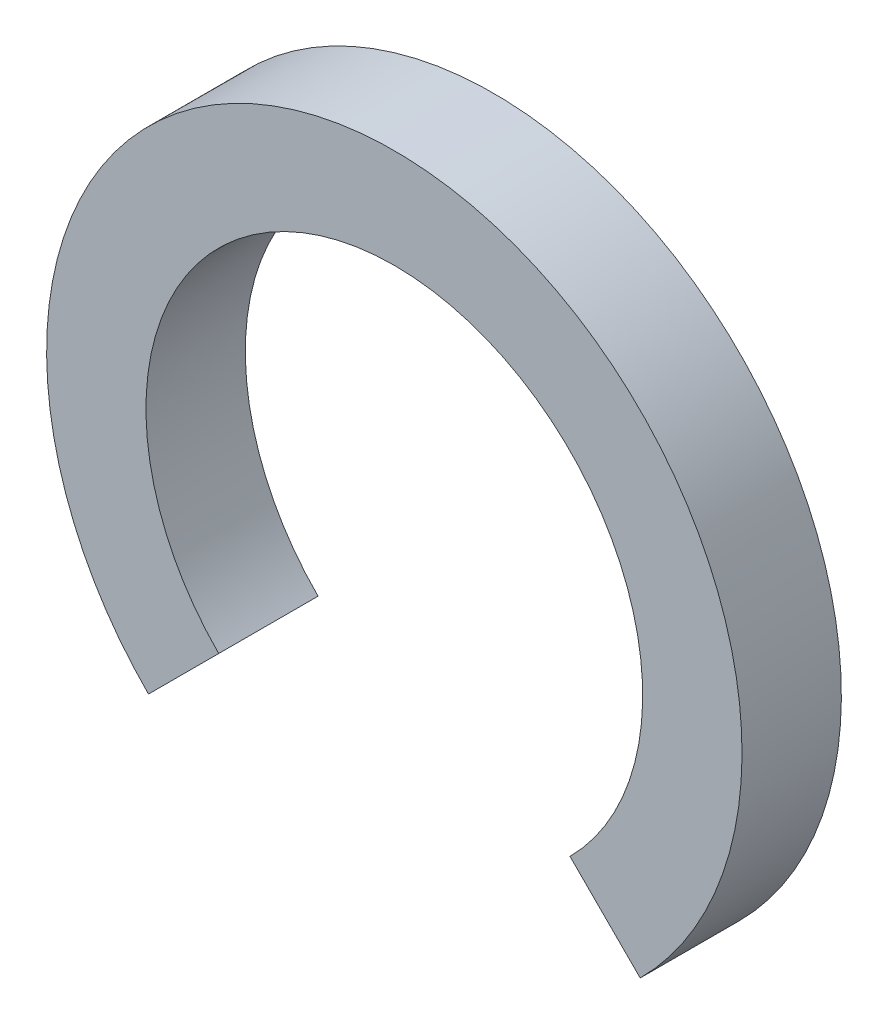
ISO-10303-21;
HEADER;
FILE_DESCRIPTION(('STEP AP214'),'2;1');
FILE_NAME('part.step','',(''),(''),'','','');
FILE_SCHEMA(('AUTOMOTIVE_DESIGN { 1 0 10303 214 1 1 1 1 }'));
ENDSEC;
DATA;
#1=APPLICATION_CONTEXT('core data for automotive mechanical design processes');
#2=APPLICATION_PROTOCOL_DEFINITION('international standard','automotive_design',2000,#1);
#3=PRODUCT_CONTEXT('',#1,'mechanical');
#4=PRODUCT('Part','Part','',(#3));
#5=PRODUCT_RELATED_PRODUCT_CATEGORY('part','',(#4));
#6=PRODUCT_DEFINITION_FORMATION('','',#4);
#7=PRODUCT_DEFINITION_CONTEXT('part definition',#1,'design');
#8=PRODUCT_DEFINITION('design','',#6,#7);
#9=PRODUCT_DEFINITION_SHAPE('','',#8);
#10=(LENGTH_UNIT() NAMED_UNIT(*) SI_UNIT(.MILLI.,.METRE.));
#11=(NAMED_UNIT(*) PLANE_ANGLE_UNIT() SI_UNIT($,.RADIAN.));
#12=(NAMED_UNIT(*) SI_UNIT($,.STERADIAN.) SOLID_ANGLE_UNIT());
#13=UNCERTAINTY_MEASURE_WITH_UNIT(LENGTH_MEASURE(1.E-05),#10,'distance_accuracy_value','');
#14=(GEOMETRIC_REPRESENTATION_CONTEXT(3) GLOBAL_UNCERTAINTY_ASSIGNED_CONTEXT((#13)) GLOBAL_UNIT_ASSIGNED_CONTEXT((#10,
#11,#12)) REPRESENTATION_CONTEXT('',''));
#15=CARTESIAN_POINT('',(0.,0.,0.));
#16=DIRECTION('',(0.,0.,1.));
#17=DIRECTION('',(1.,0.,0.));
#18=AXIS2_PLACEMENT_3D('',#15,#16,#17);
#19=CARTESIAN_POINT('',(1.76776695296635,-1.76776695296638,1.));
#20=DIRECTION('',(0.707106781186532,0.707106781186563,0.));
#21=DIRECTION('',(-0.707106781186563,0.707106781186532,0.));
#22=AXIS2_PLACEMENT_3D('',#19,#20,#21);
#23=PLANE('',#22);
#24=DIRECTION('',(0.707106781186563,-0.707106781186532,0.));
#25=VECTOR('',#24,1.);
#26=CARTESIAN_POINT('',(1.76776695296635,-1.76776695296638,0.));
#27=LINE('',#26,#25);
#28=CARTESIAN_POINT('',(1.76776695296635,-1.76776695296639,0.));
#29=VERTEX_POINT('',#28);
#30=CARTESIAN_POINT('',(2.47487373415292,-2.47487373415292,0.));
#31=VERTEX_POINT('',#30);
#32=EDGE_CURVE('E110',#29,#31,#27,.T.);
#33=ORIENTED_EDGE('',*,*,#32,.T.);
#34=DIRECTION('',(0.,0.,-1.));
#35=VECTOR('',#34,1.);
#36=CARTESIAN_POINT('',(2.47487373415292,-2.47487373415292,1.));
#37=LINE('',#36,#35);
#38=CARTESIAN_POINT('',(2.47487373415292,-2.47487373415292,1.));
#39=VERTEX_POINT('',#38);
#40=EDGE_CURVE('E11',#39,#31,#37,.T.);
#41=ORIENTED_EDGE('',*,*,#40,.F.);
#42=DIRECTION('',(0.707106781186563,-0.707106781186532,0.));
#43=VECTOR('',#42,1.);
#44=CARTESIAN_POINT('',(1.76776695296635,-1.76776695296638,1.));
#45=LINE('',#44,#43);
#46=CARTESIAN_POINT('',(1.76776695296635,-1.76776695296639,1.));
#47=VERTEX_POINT('',#46);
#48=EDGE_CURVE('E92',#47,#39,#45,.T.);
#49=ORIENTED_EDGE('',*,*,#48,.F.);
#50=DIRECTION('',(0.,0.,-1.));
#51=VECTOR('',#50,1.);
#52=CARTESIAN_POINT('',(1.76776695296635,-1.76776695296639,1.));
#53=LINE('',#52,#51);
#54=EDGE_CURVE('E59',#47,#29,#53,.T.);
#55=ORIENTED_EDGE('',*,*,#54,.T.);
#56=EDGE_LOOP('',(#33,#41,#49,#55));
#57=FACE_BOUND('',#56,.T.);
#58=ADVANCED_FACE('F42',(#57),#23,.F.);
#59=CARTESIAN_POINT('',(0.,0.,1.));
#60=DIRECTION('',(0.,0.,-1.));
#61=DIRECTION('',(-1.,0.,0.));
#62=AXIS2_PLACEMENT_3D('',#59,#60,#61);
#63=CYLINDRICAL_SURFACE('',#62,3.5);
#64=CARTESIAN_POINT('',(0.,0.,0.));
#65=DIRECTION('',(0.,0.,1.));
#66=DIRECTION('',(1.,0.,0.));
#67=AXIS2_PLACEMENT_3D('',#64,#65,#66);
#68=CIRCLE('',#67,3.5);
#69=CARTESIAN_POINT('',(-2.47487373415291,-2.47487373415292,0.));
#70=VERTEX_POINT('',#69);
#71=EDGE_CURVE('E98',#31,#70,#68,.T.);
#72=ORIENTED_EDGE('',*,*,#71,.T.);
#73=DIRECTION('',(0.,0.,-1.));
#74=VECTOR('',#73,1.);
#75=CARTESIAN_POINT('',(-2.47487373415291,-2.47487373415292,1.));
#76=LINE('',#75,#74);
#77=CARTESIAN_POINT('',(-2.47487373415291,-2.47487373415292,1.));
#78=VERTEX_POINT('',#77);
#79=EDGE_CURVE('E51',#78,#70,#76,.T.);
#80=ORIENTED_EDGE('',*,*,#79,.F.);
#81=CARTESIAN_POINT('',(0.,0.,1.));
#82=DIRECTION('',(0.,0.,1.));
#83=DIRECTION('',(1.,0.,0.));
#84=AXIS2_PLACEMENT_3D('',#81,#82,#83);
#85=CIRCLE('',#84,3.5);
#86=EDGE_CURVE('E84',#39,#78,#85,.T.);
#87=ORIENTED_EDGE('',*,*,#86,.F.);
#88=ORIENTED_EDGE('',*,*,#40,.T.);
#89=EDGE_LOOP('',(#72,#80,#87,#88));
#90=FACE_BOUND('',#89,.T.);
#91=ADVANCED_FACE('F97',(#90),#63,.T.);
#92=CARTESIAN_POINT('',(-1.76776695296635,-1.76776695296638,1.));
#93=DIRECTION('',(0.707106781186532,-0.707106781186563,0.));
#94=DIRECTION('',(0.707106781186563,0.707106781186532,0.));
#95=AXIS2_PLACEMENT_3D('',#92,#93,#94);
#96=PLANE('',#95);
#97=DIRECTION('',(-0.707106781186563,-0.707106781186532,0.));
#98=VECTOR('',#97,1.);
#99=CARTESIAN_POINT('',(-1.76776695296635,-1.76776695296638,0.));
#100=LINE('',#99,#98);
#101=CARTESIAN_POINT('',(-1.76776695296635,-1.76776695296638,0.));
#102=VERTEX_POINT('',#101);
#103=EDGE_CURVE('E115',#102,#70,#100,.T.);
#104=ORIENTED_EDGE('',*,*,#103,.F.);
#105=DIRECTION('',(0.,0.,-1.));
#106=VECTOR('',#105,1.);
#107=CARTESIAN_POINT('',(-1.76776695296635,-1.76776695296638,1.));
#108=LINE('',#107,#106);
#109=CARTESIAN_POINT('',(-1.76776695296635,-1.76776695296638,1.));
#110=VERTEX_POINT('',#109);
#111=EDGE_CURVE('E73',#110,#102,#108,.T.);
#112=ORIENTED_EDGE('',*,*,#111,.F.);
#113=DIRECTION('',(-0.707106781186563,-0.707106781186532,0.));
#114=VECTOR('',#113,1.);
#115=CARTESIAN_POINT('',(-1.76776695296635,-1.76776695296638,1.));
#116=LINE('',#115,#114);
#117=EDGE_CURVE('E91',#110,#78,#116,.T.);
#118=ORIENTED_EDGE('',*,*,#117,.T.);
#119=ORIENTED_EDGE('',*,*,#79,.T.);
#120=EDGE_LOOP('',(#104,#112,#118,#119));
#121=FACE_BOUND('',#120,.T.);
#122=ADVANCED_FACE('F102',(#121),#96,.T.);
#123=CARTESIAN_POINT('',(0.,0.,1.));
#124=DIRECTION('',(0.,0.,-1.));
#125=DIRECTION('',(-1.,0.,0.));
#126=AXIS2_PLACEMENT_3D('',#123,#124,#125);
#127=CYLINDRICAL_SURFACE('',#126,2.5);
#128=CARTESIAN_POINT('',(0.,0.,0.));
#129=DIRECTION('',(0.,0.,1.));
#130=DIRECTION('',(1.,0.,0.));
#131=AXIS2_PLACEMENT_3D('',#128,#129,#130);
#132=CIRCLE('',#131,2.5);
#133=EDGE_CURVE('E118',#29,#102,#132,.T.);
#134=ORIENTED_EDGE('',*,*,#133,.F.);
#135=ORIENTED_EDGE('',*,*,#54,.F.);
#136=CARTESIAN_POINT('',(0.,0.,1.));
#137=DIRECTION('',(0.,0.,1.));
#138=DIRECTION('',(1.,0.,0.));
#139=AXIS2_PLACEMENT_3D('',#136,#137,#138);
#140=CIRCLE('',#139,2.5);
#141=EDGE_CURVE('E104',#47,#110,#140,.T.);
#142=ORIENTED_EDGE('',*,*,#141,.T.);
#143=ORIENTED_EDGE('',*,*,#111,.T.);
#144=EDGE_LOOP('',(#134,#135,#142,#143));
#145=FACE_BOUND('',#144,.T.);
#146=ADVANCED_FACE('F128',(#145),#127,.F.);
#147=CARTESIAN_POINT('',(0.,0.,1.));
#148=DIRECTION('',(0.,0.,1.));
#149=DIRECTION('',(1.,0.,0.));
#150=AXIS2_PLACEMENT_3D('',#147,#148,#149);
#151=PLANE('',#150);
#152=ORIENTED_EDGE('',*,*,#48,.T.);
#153=ORIENTED_EDGE('',*,*,#86,.T.);
#154=ORIENTED_EDGE('',*,*,#117,.F.);
#155=ORIENTED_EDGE('',*,*,#141,.F.);
#156=EDGE_LOOP('',(#152,#153,#154,#155));
#157=FACE_BOUND('',#156,.T.);
#158=ADVANCED_FACE('F88',(#157),#151,.T.);
#159=CARTESIAN_POINT('',(0.,0.,0.));
#160=DIRECTION('',(0.,0.,1.));
#161=DIRECTION('',(1.,0.,0.));
#162=AXIS2_PLACEMENT_3D('',#159,#160,#161);
#163=PLANE('',#162);
#164=ORIENTED_EDGE('',*,*,#32,.F.);
#165=ORIENTED_EDGE('',*,*,#133,.T.);
#166=ORIENTED_EDGE('',*,*,#103,.T.);
#167=ORIENTED_EDGE('',*,*,#71,.F.);
#168=EDGE_LOOP('',(#164,#165,#166,#167));
#169=FACE_BOUND('',#168,.T.);
#170=ADVANCED_FACE('F127',(#169),#163,.F.);
#171=CLOSED_SHELL('',(#58,#91,#122,#146,#158,#170));
#172=MANIFOLD_SOLID_BREP('B2',#171);
#173=ADVANCED_BREP_SHAPE_REPRESENTATION('',(#18,#172),#14);
#174=SHAPE_DEFINITION_REPRESENTATION(#9,#173);
ENDSEC;
END-ISO-10303-21;
